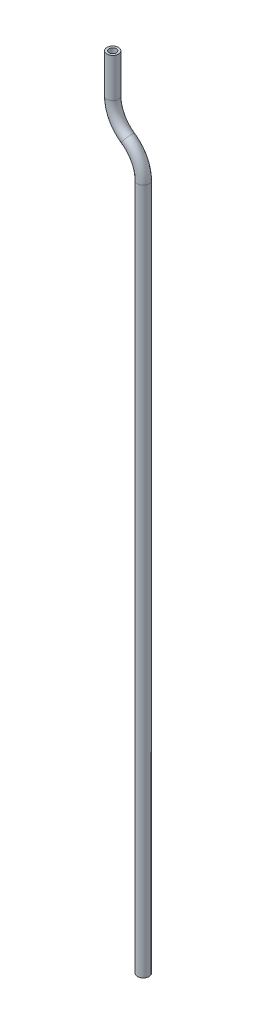
ISO-10303-21;
HEADER;
FILE_DESCRIPTION(('STEP AP214'),'2;1');
FILE_NAME('part.step','',(''),(''),'','','');
FILE_SCHEMA(('AUTOMOTIVE_DESIGN { 1 0 10303 214 1 1 1 1 }'));
ENDSEC;
DATA;
#1=APPLICATION_CONTEXT('core data for automotive mechanical design processes');
#2=APPLICATION_PROTOCOL_DEFINITION('international standard','automotive_design',2000,#1);
#3=PRODUCT_CONTEXT('',#1,'mechanical');
#4=PRODUCT('Part','Part','',(#3));
#5=PRODUCT_RELATED_PRODUCT_CATEGORY('part','',(#4));
#6=PRODUCT_DEFINITION_FORMATION('','',#4);
#7=PRODUCT_DEFINITION_CONTEXT('part definition',#1,'design');
#8=PRODUCT_DEFINITION('design','',#6,#7);
#9=PRODUCT_DEFINITION_SHAPE('','',#8);
#10=(LENGTH_UNIT() NAMED_UNIT(*) SI_UNIT(.MILLI.,.METRE.));
#11=(NAMED_UNIT(*) PLANE_ANGLE_UNIT() SI_UNIT($,.RADIAN.));
#12=(NAMED_UNIT(*) SI_UNIT($,.STERADIAN.) SOLID_ANGLE_UNIT());
#13=UNCERTAINTY_MEASURE_WITH_UNIT(LENGTH_MEASURE(1.E-05),#10,'distance_accuracy_value','');
#14=(GEOMETRIC_REPRESENTATION_CONTEXT(3) GLOBAL_UNCERTAINTY_ASSIGNED_CONTEXT((#13)) GLOBAL_UNIT_ASSIGNED_CONTEXT((#10,
#11,#12)) REPRESENTATION_CONTEXT('',''));
#15=CARTESIAN_POINT('',(0.,0.,0.));
#16=DIRECTION('',(0.,0.,1.));
#17=DIRECTION('',(1.,0.,0.));
#18=AXIS2_PLACEMENT_3D('',#15,#16,#17);
#19=CARTESIAN_POINT('',(-13.55,0.,0.));
#20=DIRECTION('',(0.,-1.,0.));
#21=DIRECTION('',(0.,0.,-1.));
#22=AXIS2_PLACEMENT_3D('',#19,#20,#21);
#23=CYLINDRICAL_SURFACE('',#22,2.);
#24=CARTESIAN_POINT('',(-13.55,-13.5,0.));
#25=DIRECTION('',(0.,1.,0.));
#26=DIRECTION('',(0.,0.,1.));
#27=AXIS2_PLACEMENT_3D('',#24,#25,#26);
#28=CIRCLE('',#27,2.);
#29=CARTESIAN_POINT('',(-15.55,-13.5,0.));
#30=VERTEX_POINT('',#29);
#31=EDGE_CURVE('E59',#30,#30,#28,.T.);
#32=ORIENTED_EDGE('',*,*,#31,.T.);
#33=EDGE_LOOP('',(#32));
#34=FACE_BOUND('',#33,.T.);
#35=CARTESIAN_POINT('',(-13.55,0.,0.));
#36=DIRECTION('',(0.,1.,0.));
#37=DIRECTION('',(0.,0.,1.));
#38=AXIS2_PLACEMENT_3D('',#35,#36,#37);
#39=CIRCLE('',#38,2.);
#40=CARTESIAN_POINT('',(-13.55,0.,2.));
#41=VERTEX_POINT('',#40);
#42=EDGE_CURVE('E56',#41,#41,#39,.T.);
#43=ORIENTED_EDGE('',*,*,#42,.F.);
#44=EDGE_LOOP('',(#43));
#45=FACE_BOUND('',#44,.T.);
#46=ADVANCED_FACE('F35',(#34,#45),#23,.T.);
#47=CARTESIAN_POINT('',(-1.43382701421798,-13.5,0.));
#48=DIRECTION('',(0.,0.,1.));
#49=DIRECTION('',(1.,0.,0.));
#50=AXIS2_PLACEMENT_3D('',#47,#48,#49);
#51=TOROIDAL_SURFACE('',#50,12.116172985782,2.);
#52=CARTESIAN_POINT('',(-8.27500000000001,-23.5,0.));
#53=DIRECTION('',(-0.825343118799535,0.564631504833246,0.));
#54=DIRECTION('',(0.,0.,1.));
#55=AXIS2_PLACEMENT_3D('',#52,#53,#54);
#56=CIRCLE('',#55,2.);
#57=CARTESIAN_POINT('',(-9.4042630096665,-25.1506862375991,0.));
#58=VERTEX_POINT('',#57);
#59=EDGE_CURVE('E61',#58,#58,#56,.T.);
#60=CARTESIAN_POINT('',(-1.43382701421798,-13.5,0.));
#61=DIRECTION('',(0.,0.,1.));
#62=DIRECTION('',(1.,0.,0.));
#63=AXIS2_PLACEMENT_3D('',#60,#61,#62);
#64=CIRCLE('',#63,14.116172985782);
#65=EDGE_CURVE('',#30,#58,#64,.T.);
#66=ORIENTED_EDGE('',*,*,#31,.F.);
#67=ORIENTED_EDGE('',*,*,#59,.T.);
#68=ORIENTED_EDGE('',*,*,#65,.T.);
#69=ORIENTED_EDGE('',*,*,#65,.F.);
#70=EDGE_LOOP('',(#66,#68,#67,#69));
#71=FACE_BOUND('',#70,.T.);
#72=ADVANCED_FACE('F81',(#71),#51,.T.);
#73=CARTESIAN_POINT('',(-15.116172985782,-33.5,0.));
#74=DIRECTION('',(0.,0.,-1.));
#75=DIRECTION('',(-1.,0.,0.));
#76=AXIS2_PLACEMENT_3D('',#73,#74,#75);
#77=TOROIDAL_SURFACE('',#76,12.116172985782,2.);
#78=CARTESIAN_POINT('',(-3.,-33.5,0.));
#79=DIRECTION('',(0.,1.,0.));
#80=DIRECTION('',(0.,0.,1.));
#81=AXIS2_PLACEMENT_3D('',#78,#79,#80);
#82=CIRCLE('',#81,2.);
#83=CARTESIAN_POINT('',(-3.,-33.5,2.));
#84=VERTEX_POINT('',#83);
#85=EDGE_CURVE('E39',#84,#84,#82,.T.);
#86=ORIENTED_EDGE('',*,*,#85,.T.);
#87=EDGE_LOOP('',(#86));
#88=FACE_BOUND('',#87,.T.);
#89=ORIENTED_EDGE('',*,*,#59,.F.);
#90=EDGE_LOOP('',(#89));
#91=FACE_BOUND('',#90,.T.);
#92=ADVANCED_FACE('F68',(#88,#91),#77,.T.);
#93=CARTESIAN_POINT('',(-3.,-33.5,0.));
#94=DIRECTION('',(0.,-1.,0.));
#95=DIRECTION('',(0.,0.,-1.));
#96=AXIS2_PLACEMENT_3D('',#93,#94,#95);
#97=CYLINDRICAL_SURFACE('',#96,2.);
#98=CARTESIAN_POINT('',(-3.,-270.5,0.));
#99=DIRECTION('',(0.,1.,0.));
#100=DIRECTION('',(0.,0.,1.));
#101=AXIS2_PLACEMENT_3D('',#98,#99,#100);
#102=CIRCLE('',#101,2.);
#103=CARTESIAN_POINT('',(-3.,-270.5,2.));
#104=VERTEX_POINT('',#103);
#105=EDGE_CURVE('E52',#104,#104,#102,.T.);
#106=ORIENTED_EDGE('',*,*,#105,.T.);
#107=EDGE_LOOP('',(#106));
#108=FACE_BOUND('',#107,.T.);
#109=ORIENTED_EDGE('',*,*,#85,.F.);
#110=EDGE_LOOP('',(#109));
#111=FACE_BOUND('',#110,.T.);
#112=ADVANCED_FACE('F37',(#108,#111),#97,.T.);
#113=CARTESIAN_POINT('',(-13.55,0.,0.));
#114=DIRECTION('',(0.,1.,0.));
#115=DIRECTION('',(0.,0.,1.));
#116=AXIS2_PLACEMENT_3D('',#113,#114,#115);
#117=PLANE('',#116);
#118=CARTESIAN_POINT('',(-13.55,0.,0.));
#119=DIRECTION('',(0.,1.,0.));
#120=DIRECTION('',(0.,0.,1.));
#121=AXIS2_PLACEMENT_3D('',#118,#119,#120);
#122=CIRCLE('',#121,1.25);
#123=CARTESIAN_POINT('',(-13.55,0.,1.25));
#124=VERTEX_POINT('',#123);
#125=EDGE_CURVE('E55',#124,#124,#122,.F.);
#126=ORIENTED_EDGE('',*,*,#125,.T.);
#127=EDGE_LOOP('',(#126));
#128=FACE_BOUND('',#127,.T.);
#129=ORIENTED_EDGE('',*,*,#42,.T.);
#130=EDGE_LOOP('',(#129));
#131=FACE_BOUND('',#130,.T.);
#132=ADVANCED_FACE('F72',(#128,#131),#117,.T.);
#133=CARTESIAN_POINT('',(-3.,-270.5,0.));
#134=DIRECTION('',(0.,1.,0.));
#135=DIRECTION('',(0.,0.,1.));
#136=AXIS2_PLACEMENT_3D('',#133,#134,#135);
#137=PLANE('',#136);
#138=CARTESIAN_POINT('',(-3.,-270.5,0.));
#139=DIRECTION('',(0.,1.,0.));
#140=DIRECTION('',(0.,0.,1.));
#141=AXIS2_PLACEMENT_3D('',#138,#139,#140);
#142=CIRCLE('',#141,1.25);
#143=CARTESIAN_POINT('',(-3.,-270.5,1.25));
#144=VERTEX_POINT('',#143);
#145=EDGE_CURVE('E10',#144,#144,#142,.F.);
#146=ORIENTED_EDGE('',*,*,#145,.F.);
#147=EDGE_LOOP('',(#146));
#148=FACE_BOUND('',#147,.T.);
#149=ORIENTED_EDGE('',*,*,#105,.F.);
#150=EDGE_LOOP('',(#149));
#151=FACE_BOUND('',#150,.T.);
#152=ADVANCED_FACE('F78',(#148,#151),#137,.F.);
#153=CARTESIAN_POINT('',(-13.55,0.,0.));
#154=DIRECTION('',(0.,-1.,0.));
#155=DIRECTION('',(0.,0.,-1.));
#156=AXIS2_PLACEMENT_3D('',#153,#154,#155);
#157=CYLINDRICAL_SURFACE('',#156,1.25);
#158=CARTESIAN_POINT('',(-13.55,-13.5,0.));
#159=DIRECTION('',(0.,1.,0.));
#160=DIRECTION('',(0.,0.,1.));
#161=AXIS2_PLACEMENT_3D('',#158,#159,#160);
#162=CIRCLE('',#161,1.25);
#163=CARTESIAN_POINT('',(-14.8,-13.5,0.));
#164=VERTEX_POINT('',#163);
#165=EDGE_CURVE('E168',#164,#164,#162,.F.);
#166=ORIENTED_EDGE('',*,*,#165,.T.);
#167=EDGE_LOOP('',(#166));
#168=FACE_BOUND('',#167,.T.);
#169=ORIENTED_EDGE('',*,*,#125,.F.);
#170=EDGE_LOOP('',(#169));
#171=FACE_BOUND('',#170,.T.);
#172=ADVANCED_FACE('F96',(#168,#171),#157,.F.);
#173=CARTESIAN_POINT('',(-1.43382701421798,-13.5,0.));
#174=DIRECTION('',(0.,0.,1.));
#175=DIRECTION('',(1.,0.,0.));
#176=AXIS2_PLACEMENT_3D('',#173,#174,#175);
#177=TOROIDAL_SURFACE('',#176,12.116172985782,1.25);
#178=CARTESIAN_POINT('',(-8.27500000000001,-23.5,0.));
#179=DIRECTION('',(-0.825343118799535,0.564631504833246,0.));
#180=DIRECTION('',(0.,0.,1.));
#181=AXIS2_PLACEMENT_3D('',#178,#179,#180);
#182=CIRCLE('',#181,1.25);
#183=CARTESIAN_POINT('',(-8.98078938104157,-24.5316788984994,0.));
#184=VERTEX_POINT('',#183);
#185=EDGE_CURVE('E48',#184,#184,#182,.F.);
#186=CARTESIAN_POINT('',(-1.43382701421798,-13.5,0.));
#187=DIRECTION('',(0.,0.,1.));
#188=DIRECTION('',(1.,0.,0.));
#189=AXIS2_PLACEMENT_3D('',#186,#187,#188);
#190=CIRCLE('',#189,13.366172985782);
#191=EDGE_CURVE('',#164,#184,#190,.T.);
#192=ORIENTED_EDGE('',*,*,#165,.F.);
#193=ORIENTED_EDGE('',*,*,#185,.T.);
#194=ORIENTED_EDGE('',*,*,#191,.T.);
#195=ORIENTED_EDGE('',*,*,#191,.F.);
#196=EDGE_LOOP('',(#192,#194,#193,#195));
#197=FACE_BOUND('',#196,.T.);
#198=ADVANCED_FACE('F89',(#197),#177,.F.);
#199=CARTESIAN_POINT('',(-15.116172985782,-33.5,0.));
#200=DIRECTION('',(0.,0.,-1.));
#201=DIRECTION('',(-1.,0.,0.));
#202=AXIS2_PLACEMENT_3D('',#199,#200,#201);
#203=TOROIDAL_SURFACE('',#202,12.116172985782,1.25);
#204=CARTESIAN_POINT('',(-3.,-33.5,0.));
#205=DIRECTION('',(0.,1.,0.));
#206=DIRECTION('',(0.,0.,1.));
#207=AXIS2_PLACEMENT_3D('',#204,#205,#206);
#208=CIRCLE('',#207,1.25);
#209=CARTESIAN_POINT('',(-3.,-33.5,1.25));
#210=VERTEX_POINT('',#209);
#211=EDGE_CURVE('E43',#210,#210,#208,.F.);
#212=ORIENTED_EDGE('',*,*,#211,.T.);
#213=EDGE_LOOP('',(#212));
#214=FACE_BOUND('',#213,.T.);
#215=ORIENTED_EDGE('',*,*,#185,.F.);
#216=EDGE_LOOP('',(#215));
#217=FACE_BOUND('',#216,.T.);
#218=ADVANCED_FACE('F84',(#214,#217),#203,.F.);
#219=CARTESIAN_POINT('',(-3.,-33.5,0.));
#220=DIRECTION('',(0.,-1.,0.));
#221=DIRECTION('',(0.,0.,-1.));
#222=AXIS2_PLACEMENT_3D('',#219,#220,#221);
#223=CYLINDRICAL_SURFACE('',#222,1.25);
#224=ORIENTED_EDGE('',*,*,#145,.T.);
#225=EDGE_LOOP('',(#224));
#226=FACE_BOUND('',#225,.T.);
#227=ORIENTED_EDGE('',*,*,#211,.F.);
#228=EDGE_LOOP('',(#227));
#229=FACE_BOUND('',#228,.T.);
#230=ADVANCED_FACE('F82',(#226,#229),#223,.F.);
#231=CLOSED_SHELL('',(#46,#72,#92,#112,#132,#152,#172,#198,#218,#230));
#232=MANIFOLD_SOLID_BREP('B2',#231);
#233=ADVANCED_BREP_SHAPE_REPRESENTATION('',(#18,#232),#14);
#234=SHAPE_DEFINITION_REPRESENTATION(#9,#233);
ENDSEC;
END-ISO-10303-21;
